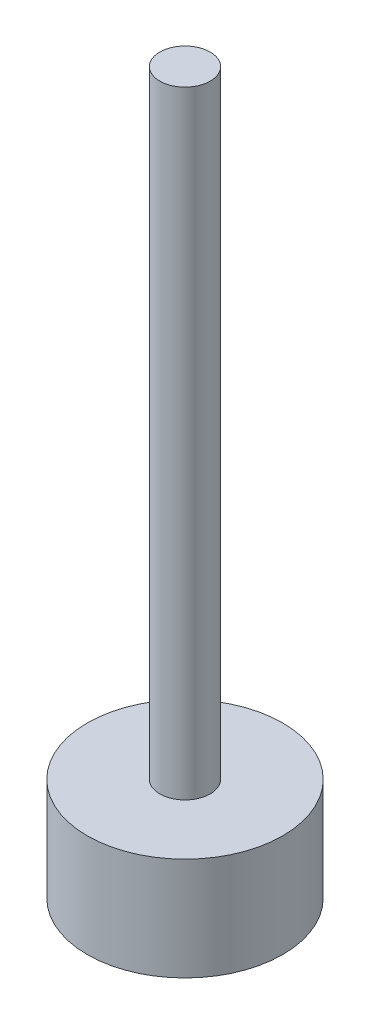
ISO-10303-21;
HEADER;
FILE_DESCRIPTION(('STEP AP214'),'2;1');
FILE_NAME('part.step','',(''),(''),'','','');
FILE_SCHEMA(('AUTOMOTIVE_DESIGN { 1 0 10303 214 1 1 1 1 }'));
ENDSEC;
DATA;
#1=APPLICATION_CONTEXT('core data for automotive mechanical design processes');
#2=APPLICATION_PROTOCOL_DEFINITION('international standard','automotive_design',2000,#1);
#3=PRODUCT_CONTEXT('',#1,'mechanical');
#4=PRODUCT('Part','Part','',(#3));
#5=PRODUCT_RELATED_PRODUCT_CATEGORY('part','',(#4));
#6=PRODUCT_DEFINITION_FORMATION('','',#4);
#7=PRODUCT_DEFINITION_CONTEXT('part definition',#1,'design');
#8=PRODUCT_DEFINITION('design','',#6,#7);
#9=PRODUCT_DEFINITION_SHAPE('','',#8);
#10=(LENGTH_UNIT() NAMED_UNIT(*) SI_UNIT(.MILLI.,.METRE.));
#11=(NAMED_UNIT(*) PLANE_ANGLE_UNIT() SI_UNIT($,.RADIAN.));
#12=(NAMED_UNIT(*) SI_UNIT($,.STERADIAN.) SOLID_ANGLE_UNIT());
#13=UNCERTAINTY_MEASURE_WITH_UNIT(LENGTH_MEASURE(1.E-05),#10,'distance_accuracy_value','');
#14=(GEOMETRIC_REPRESENTATION_CONTEXT(3) GLOBAL_UNCERTAINTY_ASSIGNED_CONTEXT((#13)) GLOBAL_UNIT_ASSIGNED_CONTEXT((#10,
#11,#12)) REPRESENTATION_CONTEXT('',''));
#15=CARTESIAN_POINT('',(0.,0.,0.));
#16=DIRECTION('',(0.,0.,1.));
#17=DIRECTION('',(1.,0.,0.));
#18=AXIS2_PLACEMENT_3D('',#15,#16,#17);
#19=CARTESIAN_POINT('',(0.,12.7,0.));
#20=DIRECTION('',(0.,-1.,0.));
#21=DIRECTION('',(0.,0.,-1.));
#22=AXIS2_PLACEMENT_3D('',#19,#20,#21);
#23=CYLINDRICAL_SURFACE('',#22,12.065);
#24=CARTESIAN_POINT('',(0.,12.7,0.));
#25=DIRECTION('',(0.,1.,0.));
#26=DIRECTION('',(0.,0.,1.));
#27=AXIS2_PLACEMENT_3D('',#24,#25,#26);
#28=CIRCLE('',#27,12.065);
#29=CARTESIAN_POINT('',(0.,12.7,12.065));
#30=VERTEX_POINT('',#29);
#31=EDGE_CURVE('E51',#30,#30,#28,.T.);
#32=ORIENTED_EDGE('',*,*,#31,.F.);
#33=EDGE_LOOP('',(#32));
#34=FACE_BOUND('',#33,.T.);
#35=CARTESIAN_POINT('',(0.,0.,0.));
#36=DIRECTION('',(0.,1.,0.));
#37=DIRECTION('',(0.,0.,1.));
#38=AXIS2_PLACEMENT_3D('',#35,#36,#37);
#39=CIRCLE('',#38,12.065);
#40=CARTESIAN_POINT('',(0.,0.,12.065));
#41=VERTEX_POINT('',#40);
#42=EDGE_CURVE('E46',#41,#41,#39,.T.);
#43=ORIENTED_EDGE('',*,*,#42,.T.);
#44=EDGE_LOOP('',(#43));
#45=FACE_BOUND('',#44,.T.);
#46=ADVANCED_FACE('F43',(#34,#45),#23,.T.);
#47=CARTESIAN_POINT('',(0.,12.7,0.));
#48=DIRECTION('',(0.,1.,0.));
#49=DIRECTION('',(0.,0.,1.));
#50=AXIS2_PLACEMENT_3D('',#47,#48,#49);
#51=PLANE('',#50);
#52=CARTESIAN_POINT('',(0.,12.7,0.));
#53=DIRECTION('',(0.,1.,0.));
#54=DIRECTION('',(0.,0.,1.));
#55=AXIS2_PLACEMENT_3D('',#52,#53,#54);
#56=CIRCLE('',#55,3.1115);
#57=CARTESIAN_POINT('',(0.,12.7,-3.1115));
#58=VERTEX_POINT('',#57);
#59=EDGE_CURVE('E10',#58,#58,#56,.T.);
#60=ORIENTED_EDGE('',*,*,#59,.F.);
#61=EDGE_LOOP('',(#60));
#62=FACE_BOUND('',#61,.T.);
#63=ORIENTED_EDGE('',*,*,#31,.T.);
#64=EDGE_LOOP('',(#63));
#65=FACE_BOUND('',#64,.T.);
#66=ADVANCED_FACE('F71',(#62,#65),#51,.T.);
#67=CARTESIAN_POINT('',(0.,0.,0.));
#68=DIRECTION('',(0.,1.,0.));
#69=DIRECTION('',(0.,0.,1.));
#70=AXIS2_PLACEMENT_3D('',#67,#68,#69);
#71=PLANE('',#70);
#72=ORIENTED_EDGE('',*,*,#42,.F.);
#73=EDGE_LOOP('',(#72));
#74=FACE_BOUND('',#73,.T.);
#75=ADVANCED_FACE('F68',(#74),#71,.F.);
#76=CARTESIAN_POINT('',(0.,88.9,0.));
#77=DIRECTION('',(0.,-1.,0.));
#78=DIRECTION('',(0.,0.,-1.));
#79=AXIS2_PLACEMENT_3D('',#76,#77,#78);
#80=CYLINDRICAL_SURFACE('',#79,3.1115);
#81=CARTESIAN_POINT('',(0.,88.9,0.));
#82=DIRECTION('',(0.,1.,0.));
#83=DIRECTION('',(0.,0.,1.));
#84=AXIS2_PLACEMENT_3D('',#81,#82,#83);
#85=CIRCLE('',#84,3.1115);
#86=CARTESIAN_POINT('',(0.,88.9,-3.1115));
#87=VERTEX_POINT('',#86);
#88=EDGE_CURVE('E58',#87,#87,#85,.T.);
#89=CARTESIAN_POINT('',(0.,88.9,-3.1115));
#90=CARTESIAN_POINT('',(0.,88.10625,-3.1115));
#91=CARTESIAN_POINT('',(0.,87.3125,-3.1115));
#92=CARTESIAN_POINT('',(0.,85.725,-3.1115));
#93=CARTESIAN_POINT('',(0.,84.93125,-3.1115));
#94=CARTESIAN_POINT('',(0.,83.34375,-3.1115));
#95=CARTESIAN_POINT('',(0.,82.55,-3.1115));
#96=CARTESIAN_POINT('',(0.,80.9625,-3.1115));
#97=CARTESIAN_POINT('',(0.,80.16875,-3.1115));
#98=CARTESIAN_POINT('',(0.,78.58125,-3.1115));
#99=CARTESIAN_POINT('',(0.,77.7875,-3.1115));
#100=CARTESIAN_POINT('',(0.,76.2,-3.1115));
#101=CARTESIAN_POINT('',(0.,75.40625,-3.1115));
#102=CARTESIAN_POINT('',(0.,73.81875,-3.1115));
#103=CARTESIAN_POINT('',(0.,73.025,-3.1115));
#104=CARTESIAN_POINT('',(0.,71.4375,-3.1115));
#105=CARTESIAN_POINT('',(0.,70.64375,-3.1115));
#106=CARTESIAN_POINT('',(0.,69.05625,-3.1115));
#107=CARTESIAN_POINT('',(0.,68.2625,-3.1115));
#108=CARTESIAN_POINT('',(0.,66.675,-3.1115));
#109=CARTESIAN_POINT('',(0.,65.88125,-3.1115));
#110=CARTESIAN_POINT('',(0.,64.29375,-3.1115));
#111=CARTESIAN_POINT('',(0.,63.5,-3.1115));
#112=CARTESIAN_POINT('',(0.,61.9125,-3.1115));
#113=CARTESIAN_POINT('',(0.,61.11875,-3.1115));
#114=CARTESIAN_POINT('',(0.,59.53125,-3.1115));
#115=CARTESIAN_POINT('',(0.,58.7375,-3.1115));
#116=CARTESIAN_POINT('',(0.,57.15,-3.1115));
#117=CARTESIAN_POINT('',(0.,56.35625,-3.1115));
#118=CARTESIAN_POINT('',(0.,54.76875,-3.1115));
#119=CARTESIAN_POINT('',(0.,53.975,-3.1115));
#120=CARTESIAN_POINT('',(0.,52.3875,-3.1115));
#121=CARTESIAN_POINT('',(0.,51.59375,-3.1115));
#122=CARTESIAN_POINT('',(0.,50.00625,-3.1115));
#123=CARTESIAN_POINT('',(0.,49.2125,-3.1115));
#124=CARTESIAN_POINT('',(0.,47.625,-3.1115));
#125=CARTESIAN_POINT('',(0.,46.83125,-3.1115));
#126=CARTESIAN_POINT('',(0.,45.24375,-3.1115));
#127=CARTESIAN_POINT('',(0.,44.45,-3.1115));
#128=CARTESIAN_POINT('',(0.,42.8625,-3.1115));
#129=CARTESIAN_POINT('',(0.,42.06875,-3.1115));
#130=CARTESIAN_POINT('',(0.,40.48125,-3.1115));
#131=CARTESIAN_POINT('',(0.,39.6875,-3.1115));
#132=CARTESIAN_POINT('',(0.,38.1,-3.1115));
#133=CARTESIAN_POINT('',(0.,37.30625,-3.1115));
#134=CARTESIAN_POINT('',(0.,35.71875,-3.1115));
#135=CARTESIAN_POINT('',(0.,34.925,-3.1115));
#136=CARTESIAN_POINT('',(0.,33.3375,-3.1115));
#137=CARTESIAN_POINT('',(0.,32.54375,-3.1115));
#138=CARTESIAN_POINT('',(0.,30.95625,-3.1115));
#139=CARTESIAN_POINT('',(0.,30.1625,-3.1115));
#140=CARTESIAN_POINT('',(0.,28.575,-3.1115));
#141=CARTESIAN_POINT('',(0.,27.78125,-3.1115));
#142=CARTESIAN_POINT('',(0.,26.19375,-3.1115));
#143=CARTESIAN_POINT('',(0.,25.4,-3.1115));
#144=CARTESIAN_POINT('',(0.,23.8125,-3.1115));
#145=CARTESIAN_POINT('',(0.,23.01875,-3.1115));
#146=CARTESIAN_POINT('',(0.,21.43125,-3.1115));
#147=CARTESIAN_POINT('',(0.,20.6375,-3.1115));
#148=CARTESIAN_POINT('',(0.,19.05,-3.1115));
#149=CARTESIAN_POINT('',(0.,18.25625,-3.1115));
#150=CARTESIAN_POINT('',(0.,16.66875,-3.1115));
#151=CARTESIAN_POINT('',(0.,15.875,-3.1115));
#152=CARTESIAN_POINT('',(0.,14.2875,-3.1115));
#153=CARTESIAN_POINT('',(0.,13.49375,-3.1115));
#154=CARTESIAN_POINT('',(0.,12.7,-3.1115));
#155=B_SPLINE_CURVE_WITH_KNOTS('',3,(#89,#90,#91,#92,#93,#94,#95,#96,#97,#98,#99,#100,#101,#102,
#103,#104,#105,#106,#107,#108,#109,#110,#111,#112,#113,#114,#115,#116,#117,#118,#119,#120,#121,
#122,#123,#124,#125,#126,#127,#128,#129,#130,#131,#132,#133,#134,#135,#136,#137,#138,#139,#140,
#141,#142,#143,#144,#145,#146,#147,#148,#149,#150,#151,#152,#153,#154),.UNSPECIFIED.,.F.,.F.,(4,
2,2,2,2,2,2,2,2,2,2,2,2,2,2,2,2,2,2,2,2,2,2,2,2,2,2,2,2,2,2,2,4),(0.,2.38124999999999,
4.76249999999999,7.14374999999999,9.52499999999999,11.90625,14.2875,16.66875,19.05,21.43125,
23.8125,26.19375,28.575,30.95625,33.3375,35.71875,38.1,40.48125,42.8625,45.24375,47.625,
50.00625,52.3875,54.76875,57.15,59.53125,61.9125,64.29375,66.675,69.05625,71.4375,73.81875,
76.2),.UNSPECIFIED.);
#156=EDGE_CURVE('BSEAM70',#87,#58,#155,.T.);
#157=ORIENTED_EDGE('',*,*,#88,.F.);
#158=ORIENTED_EDGE('',*,*,#59,.T.);
#159=ORIENTED_EDGE('',*,*,#156,.T.);
#160=ORIENTED_EDGE('',*,*,#156,.F.);
#161=EDGE_LOOP('',(#157,#159,#158,#160));
#162=FACE_BOUND('',#161,.T.);
#163=ADVANCED_FACE('F70',(#162),#80,.T.);
#164=CARTESIAN_POINT('',(0.,88.9,0.));
#165=DIRECTION('',(0.,1.,0.));
#166=DIRECTION('',(0.,0.,1.));
#167=AXIS2_PLACEMENT_3D('',#164,#165,#166);
#168=PLANE('',#167);
#169=ORIENTED_EDGE('',*,*,#88,.T.);
#170=EDGE_LOOP('',(#169));
#171=FACE_BOUND('',#170,.T.);
#172=ADVANCED_FACE('F77',(#171),#168,.T.);
#173=CLOSED_SHELL('',(#46,#66,#75,#163,#172));
#174=MANIFOLD_SOLID_BREP('B2',#173);
#175=ADVANCED_BREP_SHAPE_REPRESENTATION('',(#18,#174),#14);
#176=SHAPE_DEFINITION_REPRESENTATION(#9,#175);
ENDSEC;
END-ISO-10303-21;
